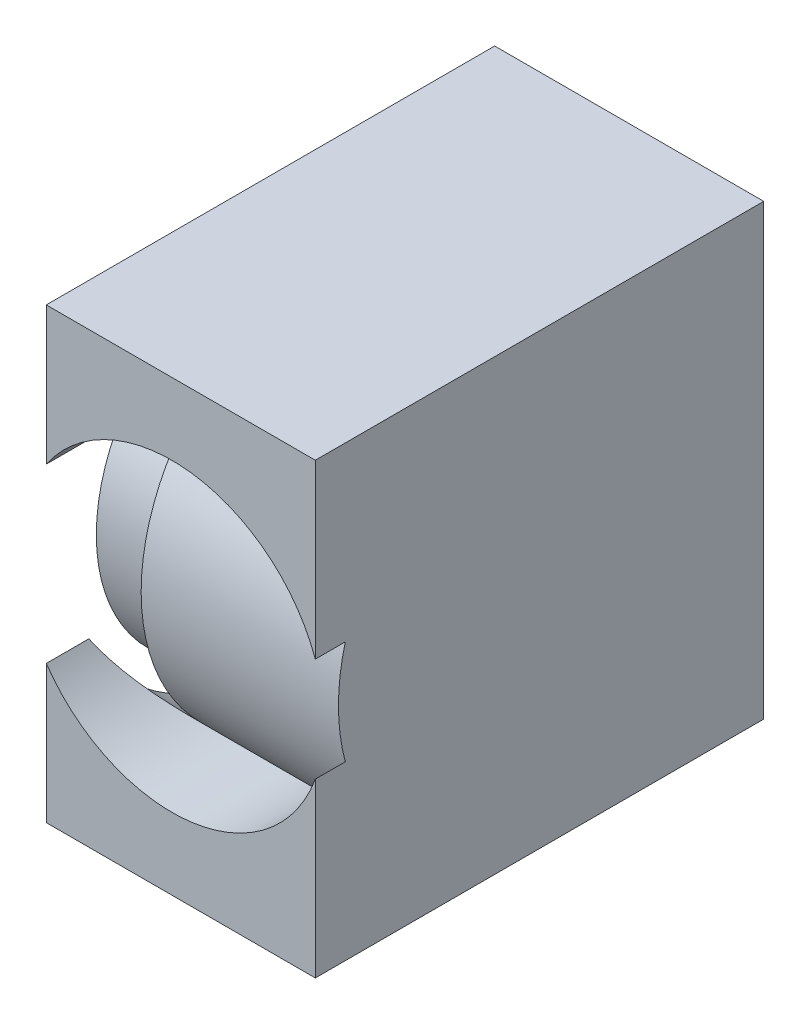
ISO-10303-21;
HEADER;
FILE_DESCRIPTION(('STEP AP214'),'2;1');
FILE_NAME('part.step','',(''),(''),'','','');
FILE_SCHEMA(('AUTOMOTIVE_DESIGN { 1 0 10303 214 1 1 1 1 }'));
ENDSEC;
DATA;
#1=APPLICATION_CONTEXT('core data for automotive mechanical design processes');
#2=APPLICATION_PROTOCOL_DEFINITION('international standard','automotive_design',2000,#1);
#3=PRODUCT_CONTEXT('',#1,'mechanical');
#4=PRODUCT('Part','Part','',(#3));
#5=PRODUCT_RELATED_PRODUCT_CATEGORY('part','',(#4));
#6=PRODUCT_DEFINITION_FORMATION('','',#4);
#7=PRODUCT_DEFINITION_CONTEXT('part definition',#1,'design');
#8=PRODUCT_DEFINITION('design','',#6,#7);
#9=PRODUCT_DEFINITION_SHAPE('','',#8);
#10=(LENGTH_UNIT() NAMED_UNIT(*) SI_UNIT(.MILLI.,.METRE.));
#11=(NAMED_UNIT(*) PLANE_ANGLE_UNIT() SI_UNIT($,.RADIAN.));
#12=(NAMED_UNIT(*) SI_UNIT($,.STERADIAN.) SOLID_ANGLE_UNIT());
#13=UNCERTAINTY_MEASURE_WITH_UNIT(LENGTH_MEASURE(1.E-05),#10,'distance_accuracy_value','');
#14=(GEOMETRIC_REPRESENTATION_CONTEXT(3) GLOBAL_UNCERTAINTY_ASSIGNED_CONTEXT((#13)) GLOBAL_UNIT_ASSIGNED_CONTEXT((#10,
#11,#12)) REPRESENTATION_CONTEXT('',''));
#15=CARTESIAN_POINT('',(0.,0.,0.));
#16=DIRECTION('',(0.,0.,1.));
#17=DIRECTION('',(1.,0.,0.));
#18=AXIS2_PLACEMENT_3D('',#15,#16,#17);
#19=CARTESIAN_POINT('',(15.,12.5,12.5));
#20=DIRECTION('',(0.,0.,-1.));
#21=DIRECTION('',(-1.,0.,0.));
#22=AXIS2_PLACEMENT_3D('',#19,#20,#21);
#23=PLANE('',#22);
#24=DIRECTION('',(0.,-1.,0.));
#25=VECTOR('',#24,1.);
#26=CARTESIAN_POINT('',(0.,12.5,12.5));
#27=LINE('',#26,#25);
#28=CARTESIAN_POINT('',(0.,12.5,12.5));
#29=VERTEX_POINT('',#28);
#30=CARTESIAN_POINT('',(0.,4.80930303745504,12.5));
#31=VERTEX_POINT('',#30);
#32=EDGE_CURVE('E169',#29,#31,#27,.T.);
#33=ORIENTED_EDGE('',*,*,#32,.T.);
#34=CARTESIAN_POINT('',(7.00860929813652,0.,12.5));
#35=DIRECTION('',(0.,0.,1.));
#36=DIRECTION('',(1.,0.,0.));
#37=AXIS2_PLACEMENT_3D('',#34,#35,#36);
#38=CIRCLE('',#37,8.5);
#39=CARTESIAN_POINT('',(15.,2.89614824381798,12.5));
#40=VERTEX_POINT('',#39);
#41=EDGE_CURVE('E196',#40,#31,#38,.T.);
#42=ORIENTED_EDGE('',*,*,#41,.F.);
#43=DIRECTION('',(0.,-1.,0.));
#44=VECTOR('',#43,1.);
#45=CARTESIAN_POINT('',(15.,12.5,12.5));
#46=LINE('',#45,#44);
#47=CARTESIAN_POINT('',(15.,12.5,12.5));
#48=VERTEX_POINT('',#47);
#49=EDGE_CURVE('E161',#48,#40,#46,.T.);
#50=ORIENTED_EDGE('',*,*,#49,.F.);
#51=DIRECTION('',(-1.,0.,0.));
#52=VECTOR('',#51,1.);
#53=CARTESIAN_POINT('',(15.,12.5,12.5));
#54=LINE('',#53,#52);
#55=EDGE_CURVE('E168',#48,#29,#54,.T.);
#56=ORIENTED_EDGE('',*,*,#55,.T.);
#57=EDGE_LOOP('',(#33,#42,#50,#56));
#58=FACE_BOUND('',#57,.T.);
#59=ADVANCED_FACE('F32',(#58),#23,.F.);
#60=CARTESIAN_POINT('',(15.,-2.89614824381798,12.5));
#61=VERTEX_POINT('',#60);
#62=CARTESIAN_POINT('',(15.,-12.5,12.5));
#63=VERTEX_POINT('',#62);
#64=EDGE_CURVE('E84',#61,#63,#46,.T.);
#65=ORIENTED_EDGE('',*,*,#64,.F.);
#66=CARTESIAN_POINT('',(0.,-4.80930303745504,12.5));
#67=VERTEX_POINT('',#66);
#68=EDGE_CURVE('E119',#67,#61,#38,.T.);
#69=ORIENTED_EDGE('',*,*,#68,.F.);
#70=CARTESIAN_POINT('',(0.,-12.5,12.5));
#71=VERTEX_POINT('',#70);
#72=EDGE_CURVE('E158',#67,#71,#27,.T.);
#73=ORIENTED_EDGE('',*,*,#72,.T.);
#74=DIRECTION('',(-1.,0.,0.));
#75=VECTOR('',#74,1.);
#76=CARTESIAN_POINT('',(15.,-12.5,12.5));
#77=LINE('',#76,#75);
#78=EDGE_CURVE('E11',#63,#71,#77,.T.);
#79=ORIENTED_EDGE('',*,*,#78,.F.);
#80=EDGE_LOOP('',(#65,#69,#73,#79));
#81=FACE_BOUND('',#80,.T.);
#82=ADVANCED_FACE('F34',(#81),#23,.F.);
#83=CARTESIAN_POINT('',(15.,-12.5,12.5));
#84=DIRECTION('',(0.,1.,0.));
#85=DIRECTION('',(0.,0.,1.));
#86=AXIS2_PLACEMENT_3D('',#83,#84,#85);
#87=PLANE('',#86);
#88=DIRECTION('',(0.,0.,-1.));
#89=VECTOR('',#88,1.);
#90=CARTESIAN_POINT('',(0.,-12.5,12.5));
#91=LINE('',#90,#89);
#92=CARTESIAN_POINT('',(0.,-12.5,-12.5));
#93=VERTEX_POINT('',#92);
#94=EDGE_CURVE('E172',#71,#93,#91,.T.);
#95=ORIENTED_EDGE('',*,*,#94,.T.);
#96=DIRECTION('',(-1.,0.,0.));
#97=VECTOR('',#96,1.);
#98=CARTESIAN_POINT('',(15.,-12.5,-12.5));
#99=LINE('',#98,#97);
#100=CARTESIAN_POINT('',(15.,-12.5,-12.5));
#101=VERTEX_POINT('',#100);
#102=EDGE_CURVE('E40',#101,#93,#99,.T.);
#103=ORIENTED_EDGE('',*,*,#102,.F.);
#104=DIRECTION('',(0.,0.,-1.));
#105=VECTOR('',#104,1.);
#106=CARTESIAN_POINT('',(15.,-12.5,12.5));
#107=LINE('',#106,#105);
#108=EDGE_CURVE('E163',#63,#101,#107,.T.);
#109=ORIENTED_EDGE('',*,*,#108,.F.);
#110=ORIENTED_EDGE('',*,*,#78,.T.);
#111=EDGE_LOOP('',(#95,#103,#109,#110));
#112=FACE_BOUND('',#111,.T.);
#113=ADVANCED_FACE('F205',(#112),#87,.F.);
#114=CARTESIAN_POINT('',(15.,12.5,-12.5));
#115=DIRECTION('',(0.,0.,1.));
#116=DIRECTION('',(1.,0.,0.));
#117=AXIS2_PLACEMENT_3D('',#114,#115,#116);
#118=PLANE('',#117);
#119=DIRECTION('',(0.,1.,0.));
#120=VECTOR('',#119,1.);
#121=CARTESIAN_POINT('',(0.,12.5,-12.5));
#122=LINE('',#121,#120);
#123=CARTESIAN_POINT('',(0.,12.5,-12.5));
#124=VERTEX_POINT('',#123);
#125=EDGE_CURVE('E174',#93,#124,#122,.T.);
#126=ORIENTED_EDGE('',*,*,#125,.T.);
#127=DIRECTION('',(-1.,0.,0.));
#128=VECTOR('',#127,1.);
#129=CARTESIAN_POINT('',(15.,12.5,-12.5));
#130=LINE('',#129,#128);
#131=CARTESIAN_POINT('',(15.,12.5,-12.5));
#132=VERTEX_POINT('',#131);
#133=EDGE_CURVE('E178',#132,#124,#130,.T.);
#134=ORIENTED_EDGE('',*,*,#133,.F.);
#135=DIRECTION('',(0.,1.,0.));
#136=VECTOR('',#135,1.);
#137=CARTESIAN_POINT('',(15.,12.5,-12.5));
#138=LINE('',#137,#136);
#139=EDGE_CURVE('E165',#101,#132,#138,.T.);
#140=ORIENTED_EDGE('',*,*,#139,.F.);
#141=ORIENTED_EDGE('',*,*,#102,.T.);
#142=EDGE_LOOP('',(#126,#134,#140,#141));
#143=FACE_BOUND('',#142,.T.);
#144=ADVANCED_FACE('F184',(#143),#118,.F.);
#145=CARTESIAN_POINT('',(15.,12.5,12.5));
#146=DIRECTION('',(0.,-1.,0.));
#147=DIRECTION('',(0.,0.,-1.));
#148=AXIS2_PLACEMENT_3D('',#145,#146,#147);
#149=PLANE('',#148);
#150=DIRECTION('',(0.,0.,1.));
#151=VECTOR('',#150,1.);
#152=CARTESIAN_POINT('',(0.,12.5,12.5));
#153=LINE('',#152,#151);
#154=EDGE_CURVE('E77',#124,#29,#153,.T.);
#155=ORIENTED_EDGE('',*,*,#154,.T.);
#156=ORIENTED_EDGE('',*,*,#55,.F.);
#157=DIRECTION('',(0.,0.,1.));
#158=VECTOR('',#157,1.);
#159=CARTESIAN_POINT('',(15.,12.5,12.5));
#160=LINE('',#159,#158);
#161=EDGE_CURVE('E56',#132,#48,#160,.T.);
#162=ORIENTED_EDGE('',*,*,#161,.F.);
#163=ORIENTED_EDGE('',*,*,#133,.T.);
#164=EDGE_LOOP('',(#155,#156,#162,#163));
#165=FACE_BOUND('',#164,.T.);
#166=ADVANCED_FACE('F197',(#165),#149,.F.);
#167=CARTESIAN_POINT('',(15.,0.,0.));
#168=DIRECTION('',(1.,0.,0.));
#169=DIRECTION('',(0.,0.,-1.));
#170=AXIS2_PLACEMENT_3D('',#167,#168,#169);
#171=PLANE('',#170);
#172=DIRECTION('',(0.,0.,1.));
#173=VECTOR('',#172,1.);
#174=CARTESIAN_POINT('',(15.,2.89614824381798,-12.501));
#175=LINE('',#174,#173);
#176=CARTESIAN_POINT('',(15.0000000000008,2.89614824381866,10.8294240543919));
#177=VERTEX_POINT('',#176);
#178=EDGE_CURVE('E121',#177,#40,#175,.T.);
#179=ORIENTED_EDGE('',*,*,#178,.F.);
#180=CARTESIAN_POINT('',(15.,0.,0.));
#181=DIRECTION('',(1.,0.,0.));
#182=DIRECTION('',(0.,0.,-1.));
#183=AXIS2_PLACEMENT_3D('',#180,#181,#182);
#184=CIRCLE('',#183,11.21);
#185=CARTESIAN_POINT('',(15.0000000000008,-2.89614824381851,10.8294240543919));
#186=VERTEX_POINT('',#185);
#187=EDGE_CURVE('E126',#177,#186,#184,.T.);
#188=ORIENTED_EDGE('',*,*,#187,.T.);
#189=DIRECTION('',(0.,0.,1.));
#190=VECTOR('',#189,1.);
#191=CARTESIAN_POINT('',(15.,-2.89614824381798,-12.501));
#192=LINE('',#191,#190);
#193=EDGE_CURVE('E113',#61,#186,#192,.F.);
#194=ORIENTED_EDGE('',*,*,#193,.F.);
#195=ORIENTED_EDGE('',*,*,#64,.T.);
#196=ORIENTED_EDGE('',*,*,#108,.T.);
#197=ORIENTED_EDGE('',*,*,#139,.T.);
#198=ORIENTED_EDGE('',*,*,#161,.T.);
#199=ORIENTED_EDGE('',*,*,#49,.T.);
#200=EDGE_LOOP('',(#179,#188,#194,#195,#196,#197,#198,#199));
#201=FACE_BOUND('',#200,.T.);
#202=ADVANCED_FACE('F133',(#201),#171,.T.);
#203=CARTESIAN_POINT('',(0.,0.,0.));
#204=DIRECTION('',(1.,0.,0.));
#205=DIRECTION('',(0.,0.,-1.));
#206=AXIS2_PLACEMENT_3D('',#203,#204,#205);
#207=PLANE('',#206);
#208=CARTESIAN_POINT('',(0.,0.,0.));
#209=DIRECTION('',(-1.,0.,0.));
#210=DIRECTION('',(0.,0.,1.));
#211=AXIS2_PLACEMENT_3D('',#208,#209,#210);
#212=CIRCLE('',#211,11.21);
#213=CARTESIAN_POINT('',(0.,4.80930303745505,10.1259421435206));
#214=VERTEX_POINT('',#213);
#215=CARTESIAN_POINT('',(0.,-4.80930303745504,10.1259421435206));
#216=VERTEX_POINT('',#215);
#217=EDGE_CURVE('E152',#214,#216,#212,.T.);
#218=ORIENTED_EDGE('',*,*,#217,.F.);
#219=DIRECTION('',(0.,0.,1.));
#220=VECTOR('',#219,1.);
#221=CARTESIAN_POINT('',(0.,4.80930303745504,-12.501));
#222=LINE('',#221,#220);
#223=EDGE_CURVE('E122',#214,#31,#222,.T.);
#224=ORIENTED_EDGE('',*,*,#223,.T.);
#225=ORIENTED_EDGE('',*,*,#32,.F.);
#226=ORIENTED_EDGE('',*,*,#154,.F.);
#227=ORIENTED_EDGE('',*,*,#125,.F.);
#228=ORIENTED_EDGE('',*,*,#94,.F.);
#229=ORIENTED_EDGE('',*,*,#72,.F.);
#230=DIRECTION('',(0.,0.,1.));
#231=VECTOR('',#230,1.);
#232=CARTESIAN_POINT('',(0.,-4.80930303745504,-12.501));
#233=LINE('',#232,#231);
#234=EDGE_CURVE('E134',#67,#216,#233,.F.);
#235=ORIENTED_EDGE('',*,*,#234,.T.);
#236=EDGE_LOOP('',(#218,#224,#225,#226,#227,#228,#229,#235));
#237=FACE_BOUND('',#236,.T.);
#238=ADVANCED_FACE('F190',(#237),#207,.F.);
#239=CARTESIAN_POINT('',(4.,0.,0.));
#240=DIRECTION('',(-1.,0.,0.));
#241=DIRECTION('',(0.,0.,1.));
#242=AXIS2_PLACEMENT_3D('',#239,#240,#241);
#243=CYLINDRICAL_SURFACE('',#242,11.21);
#244=CARTESIAN_POINT('',(4.,0.,0.));
#245=DIRECTION('',(-1.,0.,0.));
#246=DIRECTION('',(0.,0.,1.));
#247=AXIS2_PLACEMENT_3D('',#244,#245,#246);
#248=CIRCLE('',#247,11.21);
#249=CARTESIAN_POINT('',(4.,7.94973396354661,7.90353274864054));
#250=VERTEX_POINT('',#249);
#251=CARTESIAN_POINT('',(4.,-7.94973396354661,7.90353274864055));
#252=VERTEX_POINT('',#251);
#253=EDGE_CURVE('E155',#250,#252,#248,.T.);
#254=ORIENTED_EDGE('',*,*,#253,.F.);
#255=CARTESIAN_POINT('',(15.5086092981365,0.,11.21));
#256=CARTESIAN_POINT('',(15.5086080051735,-0.207063888759268,11.2099987487027));
#257=CARTESIAN_POINT('',(15.5010305412783,-0.41414995804121,11.2042500621179));
#258=CARTESIAN_POINT('',(15.4708438060725,-0.826675728749038,11.1813871108456));
#259=CARTESIAN_POINT('',(15.4482271622358,-1.03211457265502,11.1642672717819));
#260=CARTESIAN_POINT('',(15.3882906214827,-1.4399645057313,11.1190274836253));
#261=CARTESIAN_POINT('',(15.3509454849241,-1.64236977506337,11.0908886523059));
#262=CARTESIAN_POINT('',(15.2621461764061,-2.04232793451323,11.0242510215021));
#263=CARTESIAN_POINT('',(15.2106903954105,-2.23988026845018,10.9857510405457));
#264=CARTESIAN_POINT('',(15.094778332949,-2.62765597831236,10.8994835320841));
#265=CARTESIAN_POINT('',(15.0304037683864,-2.81791688983753,10.851774325859));
#266=CARTESIAN_POINT('',(14.8892768797825,-3.19138429153025,10.7478714886451));
#267=CARTESIAN_POINT('',(14.8125242601179,-3.37459061308454,10.6916776550214));
#268=CARTESIAN_POINT('',(14.6475251859878,-3.73307956422928,10.571845681415));
#269=CARTESIAN_POINT('',(14.5592847258004,-3.90836626241575,10.5082114255468));
#270=CARTESIAN_POINT('',(14.3720582245947,-4.25061006795066,10.3744968578569));
#271=CARTESIAN_POINT('',(14.2730681821663,-4.41756403954971,10.3044141471635));
#272=CARTESIAN_POINT('',(14.0554610437725,-4.75776751499395,10.1521242602664));
#273=CARTESIAN_POINT('',(13.935875034596,-4.93016328510897,10.0693954811311));
#274=CARTESIAN_POINT('',(13.6856395924812,-5.26410615950107,9.89891116947923));
#275=CARTESIAN_POINT('',(13.5549887013716,-5.42565182886577,9.81115497492576));
#276=CARTESIAN_POINT('',(13.2831375954366,-5.73787475793493,9.63189196242293));
#277=CARTESIAN_POINT('',(13.1419219536947,-5.88853546675682,9.54037975139342));
#278=CARTESIAN_POINT('',(12.8497098733404,-6.17850343181962,9.35520100763345));
#279=CARTESIAN_POINT('',(12.6987160613533,-6.31781371450804,9.26153505776743));
#280=CARTESIAN_POINT('',(12.354907868402,-6.61275393583857,9.05397654606319));
#281=CARTESIAN_POINT('',(12.1599249146499,-6.76575618475423,8.93992698876733));
#282=CARTESIAN_POINT('',(11.7565539484757,-7.05468686853381,8.71373421304674));
#283=CARTESIAN_POINT('',(11.5481618521133,-7.19061006416135,8.60159158867799));
#284=CARTESIAN_POINT('',(11.1183308090163,-7.44462339030366,8.38270532900571));
#285=CARTESIAN_POINT('',(10.8969042068188,-7.56273002821727,8.27595675776376));
#286=CARTESIAN_POINT('',(10.4411121977871,-7.78021360687809,8.07184066674657));
#287=CARTESIAN_POINT('',(10.2067542878051,-7.87960125536313,7.97446779950769));
#288=CARTESIAN_POINT('',(9.65211471208454,-8.0853923407421,7.76646150442512));
#289=CARTESIAN_POINT('',(9.32725520082757,-8.18485309244069,7.66070152051665));
#290=CARTESIAN_POINT('',(8.82633454116942,-8.30514111836959,7.5294265699054));
#291=CARTESIAN_POINT('',(8.65719177798539,-8.34040777504621,7.49024399226994));
#292=CARTESIAN_POINT('',(8.31505178403378,-8.4007937199563,7.42245437280963));
#293=CARTESIAN_POINT('',(8.14205661602257,-8.42591830713273,7.39384180911782));
#294=CARTESIAN_POINT('',(7.79152333394635,-8.46572348145011,7.3482353172627));
#295=CARTESIAN_POINT('',(7.61395692465557,-8.48029540214679,7.33136234555721));
#296=CARTESIAN_POINT('',(7.25749461650153,-8.49822885871296,7.31056764909216));
#297=CARTESIAN_POINT('',(7.07859876318695,-8.50159077689466,7.30664548265114));
#298=CARTESIAN_POINT('',(6.72110998809199,-8.49701767999157,7.31196288232991));
#299=CARTESIAN_POINT('',(6.54251714820648,-8.48907998583869,7.32120556975529));
#300=CARTESIAN_POINT('',(6.18730252857134,-8.46210298239258,7.35236918282851));
#301=CARTESIAN_POINT('',(6.01068076254917,-8.44306359583124,7.37429019671787));
#302=CARTESIAN_POINT('',(5.68092851064196,-8.39712497522792,7.42653649415025));
#303=CARTESIAN_POINT('',(5.52743287447806,-8.37138179383697,7.4556049700502));
#304=CARTESIAN_POINT('',(5.22374269316316,-8.31193211405614,7.52182595313522));
#305=CARTESIAN_POINT('',(5.07354934220462,-8.27822278503487,7.55898133348893));
#306=CARTESIAN_POINT('',(4.62858598935539,-8.16572483828516,7.68096691952662));
#307=CARTESIAN_POINT('',(4.33947552286932,-8.07557240334129,7.77630924655512));
#308=CARTESIAN_POINT('',(3.82939196766828,-7.88687186992718,7.96718083197889));
#309=CARTESIAN_POINT('',(3.60552276514285,-7.79275756044623,8.05958597373296));
#310=CARTESIAN_POINT('',(3.1695467112721,-7.58746597820032,8.2531429186702));
#311=CARTESIAN_POINT('',(2.95744618306417,-7.47627965145704,8.35429935051429));
#312=CARTESIAN_POINT('',(2.54481489882781,-7.23750636245982,8.56199165216846));
#313=CARTESIAN_POINT('',(2.34430946393765,-7.10988533509228,8.66853840817781));
#314=CARTESIAN_POINT('',(1.95547332891968,-6.8390014094828,8.8838106823586));
#315=CARTESIAN_POINT('',(1.76714066834172,-6.6957410400325,8.99253584597964));
#316=CARTESIAN_POINT('',(1.39776194245901,-6.38964326689184,9.21265971541864));
#317=CARTESIAN_POINT('',(1.21707272376175,-6.22636669535479,9.32404704393172));
#318=CARTESIAN_POINT('',(0.869443062036188,-5.88389054580373,9.54386406345971));
#319=CARTESIAN_POINT('',(0.702504014066009,-5.70468935594253,9.65229345362498));
#320=CARTESIAN_POINT('',(0.383589609835359,-5.33098040739405,9.86360757566741));
#321=CARTESIAN_POINT('',(0.231589988472241,-5.13649842496506,9.96650117164894));
#322=CARTESIAN_POINT('',(-0.056495360366088,-4.73242269467372,10.164589110481));
#323=CARTESIAN_POINT('',(-0.192584945222772,-4.52283262976382,10.2597853178269));
#324=CARTESIAN_POINT('',(-0.422694863142565,-4.13120423850469,10.4227218183853));
#325=CARTESIAN_POINT('',(-0.519760894141812,-3.95167813866106,10.4922111776123));
#326=CARTESIAN_POINT('',(-0.701655843190825,-3.58383731657226,10.6234798324259));
#327=CARTESIAN_POINT('',(-0.7864872631829,-3.39552440165989,10.685260704026));
#328=CARTESIAN_POINT('',(-0.942952046867343,-3.0109383345831,10.7999350181597));
#329=CARTESIAN_POINT('',(-1.01458995368912,-2.81466795105108,10.8528315194334));
#330=CARTESIAN_POINT('',(-1.14375954264176,-2.41515010328748,10.9486685004845));
#331=CARTESIAN_POINT('',(-1.20129106511654,-2.21190256011806,10.9916088675781));
#332=CARTESIAN_POINT('',(-1.30170755829207,-1.79838731863783,11.0668130370262));
#333=CARTESIAN_POINT('',(-1.34449245791822,-1.58808188876197,11.0990038483768));
#334=CARTESIAN_POINT('',(-1.41414892603973,-1.16337625624315,11.1515214954515));
#335=CARTESIAN_POINT('',(-1.44102044467974,-0.948976040773722,11.1718482940066));
#336=CARTESIAN_POINT('',(-1.47834619881444,-0.518021043627352,11.2001055679356));
#337=CARTESIAN_POINT('',(-1.4888070293336,-0.301467162679912,11.208041023059));
#338=CARTESIAN_POINT('',(-1.49312858707881,0.131891058434078,11.2113176641759));
#339=CARTESIAN_POINT('',(-1.48699078587021,0.348695374694717,11.2066599666256));
#340=CARTESIAN_POINT('',(-1.45978841553643,0.757340373226705,11.1860535616429));
#341=CARTESIAN_POINT('',(-1.44039864684396,0.94936020967819,11.1713718904626));
#342=CARTESIAN_POINT('',(-1.38878113402957,1.33074104253771,11.1323842569026));
#343=CARTESIAN_POINT('',(-1.3565491269808,1.52010113442511,11.1080750987353));
#344=CARTESIAN_POINT('',(-1.27971151050675,1.89481166315173,11.0503267071602));
#345=CARTESIAN_POINT('',(-1.2351091103271,2.08016312652169,11.0168898417848));
#346=CARTESIAN_POINT('',(-1.13408930445832,2.44590995636879,10.9415040535195));
#347=CARTESIAN_POINT('',(-1.07766726612261,2.62630334810168,10.899551793265));
#348=CARTESIAN_POINT('',(-0.951972074162187,2.98603808073308,10.8066235524541));
#349=CARTESIAN_POINT('',(-0.882389582627395,3.16521563718344,10.7554321096863));
#350=CARTESIAN_POINT('',(-0.732203284733219,3.51658579625977,10.6457344389806));
#351=CARTESIAN_POINT('',(-0.651595742671083,3.68877600555546,10.5872257322556));
#352=CARTESIAN_POINT('',(-0.394359462996431,4.19388067474966,10.4021038613892));
#353=CARTESIAN_POINT('',(-0.20222210510552,4.5155968215514,10.2658236917216));
#354=CARTESIAN_POINT('',(0.129905008312898,4.99800574068691,10.036081227847));
#355=CARTESIAN_POINT('',(0.258207696539986,5.16988047580715,9.94847594921414));
#356=CARTESIAN_POINT('',(0.526111351632626,5.50206262572735,9.76867471848893));
#357=CARTESIAN_POINT('',(0.66571104201252,5.66237134354869,9.67647928550498));
#358=CARTESIAN_POINT('',(0.955815342628735,5.97149366141746,9.48884318339216));
#359=CARTESIAN_POINT('',(1.10634286104305,6.12028167831564,9.39339593335511));
#360=CARTESIAN_POINT('',(1.4174990107446,6.40578280634487,9.20106852601507));
#361=CARTESIAN_POINT('',(1.57812537727739,6.54249860835583,9.10418869368192));
#362=CARTESIAN_POINT('',(1.94197578678168,6.82957211258159,8.89150948256076));
#363=CARTESIAN_POINT('',(2.14733704592516,6.97727124411584,8.77576204359812));
#364=CARTESIAN_POINT('',(2.57191931054744,7.25466109833244,8.54787792699795));
#365=CARTESIAN_POINT('',(2.79114526773441,7.38434533362292,8.43574256122196));
#366=CARTESIAN_POINT('',(3.24287459889781,7.62460327164133,8.2192225209513));
#367=CARTESIAN_POINT('',(3.47535157959085,7.73521331042794,8.11482333056436));
#368=CARTESIAN_POINT('',(3.95374053775103,7.9363083014834,7.91826153766738));
#369=CARTESIAN_POINT('',(4.19964203432827,8.02680868174918,7.82608957654047));
#370=CARTESIAN_POINT('',(4.60705094889493,8.15530438777996,7.69156352504429));
#371=CARTESIAN_POINT('',(4.76461516041421,8.20010200253926,7.6436889579212));
#372=CARTESIAN_POINT('',(5.08416838024863,8.28092190978932,7.556056132233));
#373=CARTESIAN_POINT('',(5.24615582310632,8.31694726329045,7.51629504332139));
#374=CARTESIAN_POINT('',(5.57363603841477,8.37965306148079,7.44632296190114));
#375=CARTESIAN_POINT('',(5.73912126812695,8.40635179488924,7.41609329055726));
#376=CARTESIAN_POINT('',(6.07297878183634,8.45002540179703,7.36629311393996));
#377=CARTESIAN_POINT('',(6.24135105377226,8.46700031590973,7.34672256414675));
#378=CARTESIAN_POINT('',(6.58092890885814,8.49095129797621,7.31902928021054));
#379=CARTESIAN_POINT('',(6.75214601422142,8.49785779348035,7.3109862069371));
#380=CARTESIAN_POINT('',(7.0948213399391,8.50128967086607,7.30699537487236));
#381=CARTESIAN_POINT('',(7.2662795524313,8.4978153837504,7.31104723042088));
#382=CARTESIAN_POINT('',(7.60812525026465,8.48056003428342,7.33105535622967));
#383=CARTESIAN_POINT('',(7.77851161848971,8.46676958990936,7.34702246277516));
#384=CARTESIAN_POINT('',(8.11674226049379,8.42917618062864,7.39012164755948));
#385=CARTESIAN_POINT('',(8.28458619143456,8.40537187762537,7.41725521790066));
#386=CARTESIAN_POINT('',(8.64520087103875,8.34329316862071,7.48706205488932));
#387=CARTESIAN_POINT('',(8.83730208318704,8.30323577119244,7.53160380947698));
#388=CARTESIAN_POINT('',(9.21550832268593,8.2108188128817,7.63224798342062));
#389=CARTESIAN_POINT('',(9.40160885963572,8.15845027167089,7.6883588381323));
#390=CARTESIAN_POINT('',(9.76742431130806,8.04213017354512,7.8099505288305));
#391=CARTESIAN_POINT('',(9.94712536455458,7.97815510923856,7.87545032323274));
#392=CARTESIAN_POINT('',(10.2993823431833,7.83942868747862,8.01355351096811));
#393=CARTESIAN_POINT('',(10.4719402532638,7.76468034956518,8.08615491203243));
#394=CARTESIAN_POINT('',(10.8747009025598,7.5743127959775,8.26540275399715));
#395=CARTESIAN_POINT('',(11.1016402437913,7.45401117871192,8.37443021737272));
#396=CARTESIAN_POINT('',(11.5417567530262,7.19484700966494,8.59811684618029));
#397=CARTESIAN_POINT('',(11.7549290465157,7.05597793653975,8.71277798130452));
#398=CARTESIAN_POINT('',(12.1674943996656,6.7602052163326,8.94421732151495));
#399=CARTESIAN_POINT('',(12.3668746937616,6.60328521011717,9.06099736490843));
#400=CARTESIAN_POINT('',(12.7511793234918,6.27194111642854,9.29342845133401));
#401=CARTESIAN_POINT('',(12.9361055440949,6.09751931817829,9.40907963985387));
#402=CARTESIAN_POINT('',(13.2931581800467,5.72897489963316,9.63797900713691));
#403=CARTESIAN_POINT('',(13.4650772122736,5.53461736349377,9.75117339349515));
#404=CARTESIAN_POINT('',(13.7921087078967,5.12855595680447,9.97072141261365));
#405=CARTESIAN_POINT('',(13.9472189271828,4.91684977668257,10.0770741311885));
#406=CARTESIAN_POINT('',(14.2387264360836,4.47714735288054,10.2799693214057));
#407=CARTESIAN_POINT('',(14.3751591061663,4.2491831886856,10.3765302488281));
#408=CARTESIAN_POINT('',(14.6277019494827,3.77767922151521,10.5573150720866));
#409=CARTESIAN_POINT('',(14.7438219722662,3.53414704608883,10.6415449439698));
#410=CARTESIAN_POINT('',(14.9234661770658,3.10523575190936,10.7729511421498));
#411=CARTESIAN_POINT('',(14.9925118317213,2.9232773963289,10.8238168037869));
#412=CARTESIAN_POINT('',(15.1184694959988,2.55310837855053,10.9170571174268));
#413=CARTESIAN_POINT('',(15.1753844009582,2.3648992207019,10.9594337954137));
#414=CARTESIAN_POINT('',(15.2762585212935,1.98362894763338,11.0348086993638));
#415=CARTESIAN_POINT('',(15.3202444249326,1.79057873284551,11.0678262395211));
#416=CARTESIAN_POINT('',(15.3947807641421,1.40054254464082,11.1239097225973));
#417=CARTESIAN_POINT('',(15.425336856625,1.20355826495707,11.1469798554908));
#418=CARTESIAN_POINT('',(15.4687614585812,0.838980027911938,11.1798081260384));
#419=CARTESIAN_POINT('',(15.4836870807836,0.671766585590527,11.1911125857062));
#420=CARTESIAN_POINT('',(15.503612629305,0.336373778069155,11.2062098660946));
#421=CARTESIAN_POINT('',(15.5086103483867,0.168194206406209,11.2100010164059));
#422=CARTESIAN_POINT('',(15.5086092981365,0.,11.21));
#423=B_SPLINE_CURVE_WITH_KNOTS('',3,(#255,#256,#257,#258,#259,#260,#261,#262,#263,#264,#265,
#266,#267,#268,#269,#270,#271,#272,#273,#274,#275,#276,#277,#278,#279,#280,#281,#282,#283,#284,
#285,#286,#287,#288,#289,#290,#291,#292,#293,#294,#295,#296,#297,#298,#299,#300,#301,#302,#303,
#304,#305,#306,#307,#308,#309,#310,#311,#312,#313,#314,#315,#316,#317,#318,#319,#320,#321,#322,
#323,#324,#325,#326,#327,#328,#329,#330,#331,#332,#333,#334,#335,#336,#337,#338,#339,#340,#341,
#342,#343,#344,#345,#346,#347,#348,#349,#350,#351,#352,#353,#354,#355,#356,#357,#358,#359,#360,
#361,#362,#363,#364,#365,#366,#367,#368,#369,#370,#371,#372,#373,#374,#375,#376,#377,#378,#379,
#380,#381,#382,#383,#384,#385,#386,#387,#388,#389,#390,#391,#392,#393,#394,#395,#396,#397,#398,
#399,#400,#401,#402,#403,#404,#405,#406,#407,#408,#409,#410,#411,#412,#413,#414,#415,#416,#417,
#418,#419,#420,#421,#422),.UNSPECIFIED.,.T.,.F.,(4,2,2,2,2,2,2,2,2,2,2,2,2,2,2,2,2,2,2,2,2,2,2,
2,2,2,2,2,2,2,2,2,2,2,2,2,2,2,2,2,2,2,2,2,2,2,2,2,2,2,2,2,2,2,2,2,2,2,2,2,2,2,2,2,2,2,2,2,2,2,2,
2,2,2,2,2,2,2,2,2,2,2,2,4),(0.,0.621013926781047,1.24233251245971,1.86472048642664,
2.4871794607967,3.10581863892456,3.72447259411268,4.34280502402823,4.96136841530865,
5.63733895415548,6.31339871395763,6.99046570181613,7.66735156346465,8.48494930574956,
9.30279724831445,10.1198827217376,10.936499372442,11.9996865289158,12.5306606621314,
13.0613570162744,13.5974433997529,14.1335115000545,14.6697067199522,15.2059056718292,
15.6804253464035,16.1551138874561,17.1046214366098,17.8831797280326,18.6621523555979,
19.4427664046643,20.2232544193616,21.0258216422107,21.8284701914909,22.6297927276099,
23.4309205787417,24.077090573079,24.7231282395985,25.3689430281849,26.014765125767,
26.6648872753254,27.3150114616536,27.9648743131589,28.6146795524274,29.1946610099928,
29.7748351505671,30.3548589173842,30.935110448318,31.5312357129853,32.1275634700873,
33.3193487539521,34.0139166144829,34.7084061027824,35.404396016511,36.1002304013716,
36.9338375995417,37.7677442162829,38.6000442703424,39.4317035676016,39.9432836041486,
40.4546848723007,40.9650776208161,41.4754682375654,41.989369189068,42.5032537544454,
43.0176062408616,43.5320274792017,44.1347950115534,44.7380036027651,45.3424478317968,
45.9467229750898,46.7826705631342,47.618912531445,48.4559184272023,49.2928149854949,
50.1410511559198,50.9894004334584,51.8361197827277,52.6824274149772,53.2853150704058,
53.8880586685569,54.4895491919374,55.0907861117636,55.5951122438588,56.0995504885379),.UNSPECIFIED.);
#424=EDGE_CURVE('E47',#214,#250,#423,.T.);
#425=ORIENTED_EDGE('',*,*,#424,.F.);
#426=ORIENTED_EDGE('',*,*,#217,.T.);
#427=EDGE_CURVE('E129',#252,#216,#423,.T.);
#428=ORIENTED_EDGE('',*,*,#427,.F.);
#429=EDGE_LOOP('',(#254,#425,#426,#428));
#430=FACE_BOUND('',#429,.T.);
#431=ADVANCED_FACE('F219',(#430),#243,.F.);
#432=CARTESIAN_POINT('',(4.,0.,0.));
#433=DIRECTION('',(-1.,0.,0.));
#434=DIRECTION('',(0.,0.,1.));
#435=AXIS2_PLACEMENT_3D('',#432,#433,#434);
#436=PLANE('',#435);
#437=CARTESIAN_POINT('',(4.,0.,0.));
#438=DIRECTION('',(-1.,0.,0.));
#439=DIRECTION('',(0.,0.,1.));
#440=AXIS2_PLACEMENT_3D('',#437,#438,#439);
#441=CIRCLE('',#440,9.71);
#442=CARTESIAN_POINT('',(4.,0.,9.71));
#443=VERTEX_POINT('',#442);
#444=EDGE_CURVE('E149',#443,#443,#441,.T.);
#445=ORIENTED_EDGE('',*,*,#444,.F.);
#446=EDGE_LOOP('',(#445));
#447=FACE_BOUND('',#446,.T.);
#448=ORIENTED_EDGE('',*,*,#253,.T.);
#449=EDGE_CURVE('E128',#252,#250,#248,.T.);
#450=ORIENTED_EDGE('',*,*,#449,.T.);
#451=EDGE_LOOP('',(#448,#450));
#452=FACE_BOUND('',#451,.T.);
#453=ADVANCED_FACE('F234',(#447,#452),#436,.T.);
#454=CARTESIAN_POINT('',(4.,0.,0.));
#455=DIRECTION('',(-1.,0.,0.));
#456=DIRECTION('',(0.,0.,1.));
#457=AXIS2_PLACEMENT_3D('',#454,#455,#456);
#458=CYLINDRICAL_SURFACE('',#457,9.71);
#459=ORIENTED_EDGE('',*,*,#444,.T.);
#460=EDGE_LOOP('',(#459));
#461=FACE_BOUND('',#460,.T.);
#462=CARTESIAN_POINT('',(0.,0.,0.));
#463=DIRECTION('',(-1.,0.,0.));
#464=DIRECTION('',(0.,0.,1.));
#465=AXIS2_PLACEMENT_3D('',#462,#463,#464);
#466=CIRCLE('',#465,9.71);
#467=CARTESIAN_POINT('',(0.,0.,9.71));
#468=VERTEX_POINT('',#467);
#469=EDGE_CURVE('E148',#468,#468,#466,.T.);
#470=ORIENTED_EDGE('',*,*,#469,.F.);
#471=EDGE_LOOP('',(#470));
#472=FACE_BOUND('',#471,.T.);
#473=ADVANCED_FACE('F227',(#461,#472),#458,.T.);
#474=ORIENTED_EDGE('',*,*,#469,.T.);
#475=EDGE_LOOP('',(#474));
#476=FACE_BOUND('',#475,.T.);
#477=ADVANCED_FACE('F222',(#476),#207,.F.);
#478=CARTESIAN_POINT('',(7.00860929813652,0.,-12.501));
#479=DIRECTION('',(0.,0.,1.));
#480=DIRECTION('',(1.,0.,0.));
#481=AXIS2_PLACEMENT_3D('',#478,#479,#480);
#482=CYLINDRICAL_SURFACE('',#481,8.5);
#483=ORIENTED_EDGE('',*,*,#178,.T.);
#484=ORIENTED_EDGE('',*,*,#41,.T.);
#485=ORIENTED_EDGE('',*,*,#223,.F.);
#486=ORIENTED_EDGE('',*,*,#424,.T.);
#487=EDGE_CURVE('E131',#250,#177,#423,.T.);
#488=ORIENTED_EDGE('',*,*,#487,.T.);
#489=EDGE_LOOP('',(#483,#484,#485,#486,#488));
#490=FACE_BOUND('',#489,.T.);
#491=ADVANCED_FACE('F220',(#490),#482,.F.);
#492=ORIENTED_EDGE('',*,*,#193,.T.);
#493=EDGE_CURVE('E116',#186,#252,#423,.T.);
#494=ORIENTED_EDGE('',*,*,#493,.T.);
#495=ORIENTED_EDGE('',*,*,#427,.T.);
#496=ORIENTED_EDGE('',*,*,#234,.F.);
#497=ORIENTED_EDGE('',*,*,#68,.T.);
#498=EDGE_LOOP('',(#492,#494,#495,#496,#497));
#499=FACE_BOUND('',#498,.T.);
#500=ADVANCED_FACE('F115',(#499),#482,.F.);
#501=CARTESIAN_POINT('',(4.,0.,0.));
#502=DIRECTION('',(-1.,0.,0.));
#503=DIRECTION('',(0.,0.,1.));
#504=AXIS2_PLACEMENT_3D('',#501,#502,#503);
#505=CYLINDRICAL_SURFACE('',#504,11.21);
#506=ORIENTED_EDGE('',*,*,#487,.F.);
#507=ORIENTED_EDGE('',*,*,#449,.F.);
#508=ORIENTED_EDGE('',*,*,#493,.F.);
#509=ORIENTED_EDGE('',*,*,#187,.F.);
#510=EDGE_LOOP('',(#506,#507,#508,#509));
#511=FACE_BOUND('',#510,.T.);
#512=ADVANCED_FACE('F125',(#511),#505,.T.);
#513=CLOSED_SHELL('',(#59,#82,#113,#144,#166,#202,#238,#431,#453,#473,#477,#491,#500,#512));
#514=MANIFOLD_SOLID_BREP('B2',#513);
#515=ADVANCED_BREP_SHAPE_REPRESENTATION('',(#18,#514),#14);
#516=SHAPE_DEFINITION_REPRESENTATION(#9,#515);
ENDSEC;
END-ISO-10303-21;
